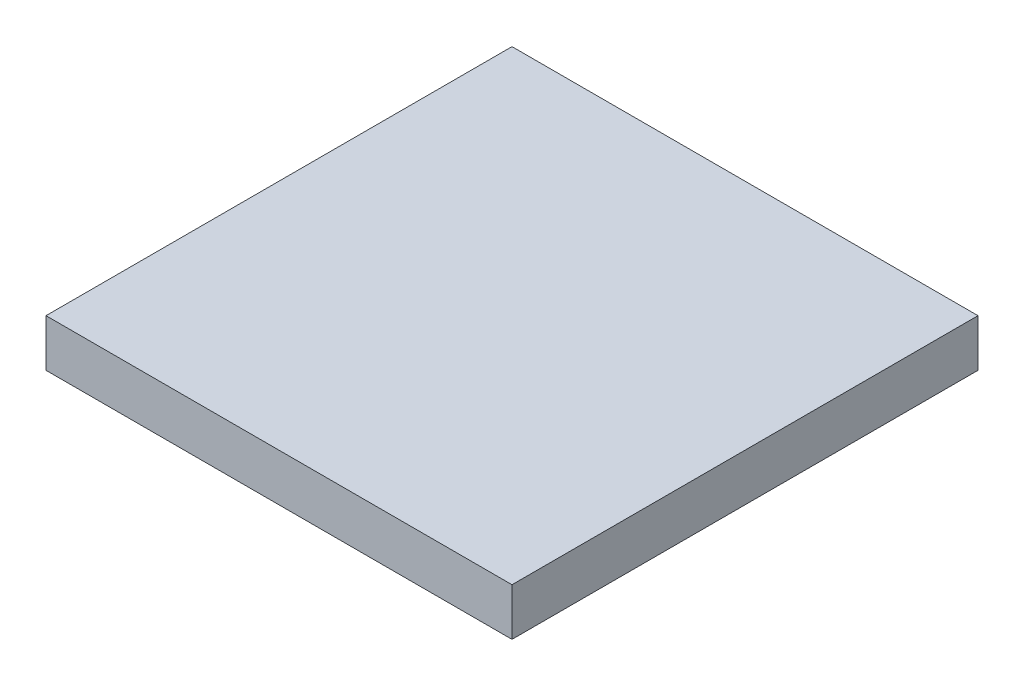
ISO-10303-21;
HEADER;
FILE_DESCRIPTION(('STEP AP214'),'2;1');
FILE_NAME('part.step','',(''),(''),'','','');
FILE_SCHEMA(('AUTOMOTIVE_DESIGN { 1 0 10303 214 1 1 1 1 }'));
ENDSEC;
DATA;
#1=APPLICATION_CONTEXT('core data for automotive mechanical design processes');
#2=APPLICATION_PROTOCOL_DEFINITION('international standard','automotive_design',2000,#1);
#3=PRODUCT_CONTEXT('',#1,'mechanical');
#4=PRODUCT('Part','Part','',(#3));
#5=PRODUCT_RELATED_PRODUCT_CATEGORY('part','',(#4));
#6=PRODUCT_DEFINITION_FORMATION('','',#4);
#7=PRODUCT_DEFINITION_CONTEXT('part definition',#1,'design');
#8=PRODUCT_DEFINITION('design','',#6,#7);
#9=PRODUCT_DEFINITION_SHAPE('','',#8);
#10=(LENGTH_UNIT() NAMED_UNIT(*) SI_UNIT(.MILLI.,.METRE.));
#11=(NAMED_UNIT(*) PLANE_ANGLE_UNIT() SI_UNIT($,.RADIAN.));
#12=(NAMED_UNIT(*) SI_UNIT($,.STERADIAN.) SOLID_ANGLE_UNIT());
#13=UNCERTAINTY_MEASURE_WITH_UNIT(LENGTH_MEASURE(1.E-05),#10,'distance_accuracy_value','');
#14=(GEOMETRIC_REPRESENTATION_CONTEXT(3) GLOBAL_UNCERTAINTY_ASSIGNED_CONTEXT((#13)) GLOBAL_UNIT_ASSIGNED_CONTEXT((#10,
#11,#12)) REPRESENTATION_CONTEXT('',''));
#15=CARTESIAN_POINT('',(0.,0.,0.));
#16=DIRECTION('',(0.,0.,1.));
#17=DIRECTION('',(1.,0.,0.));
#18=AXIS2_PLACEMENT_3D('',#15,#16,#17);
#19=CARTESIAN_POINT('',(-125.,25.4,-125.));
#20=DIRECTION('',(1.,0.,0.));
#21=DIRECTION('',(0.,0.,-1.));
#22=AXIS2_PLACEMENT_3D('',#19,#20,#21);
#23=PLANE('',#22);
#24=DIRECTION('',(0.,0.,1.));
#25=VECTOR('',#24,1.);
#26=CARTESIAN_POINT('',(-125.,0.,-125.));
#27=LINE('',#26,#25);
#28=CARTESIAN_POINT('',(-125.,0.,-125.));
#29=VERTEX_POINT('',#28);
#30=CARTESIAN_POINT('',(-125.,0.,125.));
#31=VERTEX_POINT('',#30);
#32=EDGE_CURVE('E101',#29,#31,#27,.T.);
#33=ORIENTED_EDGE('',*,*,#32,.T.);
#34=DIRECTION('',(0.,-1.,0.));
#35=VECTOR('',#34,1.);
#36=CARTESIAN_POINT('',(-125.,25.4,125.));
#37=LINE('',#36,#35);
#38=CARTESIAN_POINT('',(-125.,25.4,125.));
#39=VERTEX_POINT('',#38);
#40=EDGE_CURVE('E11',#39,#31,#37,.T.);
#41=ORIENTED_EDGE('',*,*,#40,.F.);
#42=DIRECTION('',(0.,0.,1.));
#43=VECTOR('',#42,1.);
#44=CARTESIAN_POINT('',(-125.,25.4,-125.));
#45=LINE('',#44,#43);
#46=CARTESIAN_POINT('',(-125.,25.4,-125.));
#47=VERTEX_POINT('',#46);
#48=EDGE_CURVE('E89',#47,#39,#45,.T.);
#49=ORIENTED_EDGE('',*,*,#48,.F.);
#50=DIRECTION('',(0.,-1.,0.));
#51=VECTOR('',#50,1.);
#52=CARTESIAN_POINT('',(-125.,25.4,-125.));
#53=LINE('',#52,#51);
#54=EDGE_CURVE('E97',#47,#29,#53,.T.);
#55=ORIENTED_EDGE('',*,*,#54,.T.);
#56=EDGE_LOOP('',(#33,#41,#49,#55));
#57=FACE_BOUND('',#56,.T.);
#58=ADVANCED_FACE('F38',(#57),#23,.F.);
#59=CARTESIAN_POINT('',(-125.,25.4,125.));
#60=DIRECTION('',(0.,0.,-1.));
#61=DIRECTION('',(-1.,0.,0.));
#62=AXIS2_PLACEMENT_3D('',#59,#60,#61);
#63=PLANE('',#62);
#64=DIRECTION('',(1.,0.,0.));
#65=VECTOR('',#64,1.);
#66=CARTESIAN_POINT('',(-125.,0.,125.));
#67=LINE('',#66,#65);
#68=CARTESIAN_POINT('',(125.,0.,125.));
#69=VERTEX_POINT('',#68);
#70=EDGE_CURVE('E93',#31,#69,#67,.T.);
#71=ORIENTED_EDGE('',*,*,#70,.T.);
#72=DIRECTION('',(0.,-1.,0.));
#73=VECTOR('',#72,1.);
#74=CARTESIAN_POINT('',(125.,25.4,125.));
#75=LINE('',#74,#73);
#76=CARTESIAN_POINT('',(125.,25.4,125.));
#77=VERTEX_POINT('',#76);
#78=EDGE_CURVE('E46',#77,#69,#75,.T.);
#79=ORIENTED_EDGE('',*,*,#78,.F.);
#80=DIRECTION('',(1.,0.,0.));
#81=VECTOR('',#80,1.);
#82=CARTESIAN_POINT('',(-125.,25.4,125.));
#83=LINE('',#82,#81);
#84=EDGE_CURVE('E84',#39,#77,#83,.T.);
#85=ORIENTED_EDGE('',*,*,#84,.F.);
#86=ORIENTED_EDGE('',*,*,#40,.T.);
#87=EDGE_LOOP('',(#71,#79,#85,#86));
#88=FACE_BOUND('',#87,.T.);
#89=ADVANCED_FACE('F92',(#88),#63,.F.);
#90=CARTESIAN_POINT('',(125.,25.4,-125.));
#91=DIRECTION('',(-1.,0.,0.));
#92=DIRECTION('',(0.,0.,1.));
#93=AXIS2_PLACEMENT_3D('',#90,#91,#92);
#94=PLANE('',#93);
#95=DIRECTION('',(0.,0.,-1.));
#96=VECTOR('',#95,1.);
#97=CARTESIAN_POINT('',(125.,0.,-125.));
#98=LINE('',#97,#96);
#99=CARTESIAN_POINT('',(125.,0.,-125.));
#100=VERTEX_POINT('',#99);
#101=EDGE_CURVE('E71',#69,#100,#98,.T.);
#102=ORIENTED_EDGE('',*,*,#101,.T.);
#103=DIRECTION('',(0.,-1.,0.));
#104=VECTOR('',#103,1.);
#105=CARTESIAN_POINT('',(125.,25.4,-125.));
#106=LINE('',#105,#104);
#107=CARTESIAN_POINT('',(125.,25.4,-125.));
#108=VERTEX_POINT('',#107);
#109=EDGE_CURVE('E94',#108,#100,#106,.T.);
#110=ORIENTED_EDGE('',*,*,#109,.F.);
#111=DIRECTION('',(0.,0.,-1.));
#112=VECTOR('',#111,1.);
#113=CARTESIAN_POINT('',(125.,25.4,-125.));
#114=LINE('',#113,#112);
#115=EDGE_CURVE('E87',#77,#108,#114,.T.);
#116=ORIENTED_EDGE('',*,*,#115,.F.);
#117=ORIENTED_EDGE('',*,*,#78,.T.);
#118=EDGE_LOOP('',(#102,#110,#116,#117));
#119=FACE_BOUND('',#118,.T.);
#120=ADVANCED_FACE('F95',(#119),#94,.F.);
#121=CARTESIAN_POINT('',(-125.,25.4,-125.));
#122=DIRECTION('',(0.,0.,1.));
#123=DIRECTION('',(1.,0.,0.));
#124=AXIS2_PLACEMENT_3D('',#121,#122,#123);
#125=PLANE('',#124);
#126=DIRECTION('',(-1.,0.,0.));
#127=VECTOR('',#126,1.);
#128=CARTESIAN_POINT('',(-125.,0.,-125.));
#129=LINE('',#128,#127);
#130=EDGE_CURVE('E77',#100,#29,#129,.T.);
#131=ORIENTED_EDGE('',*,*,#130,.T.);
#132=ORIENTED_EDGE('',*,*,#54,.F.);
#133=DIRECTION('',(-1.,0.,0.));
#134=VECTOR('',#133,1.);
#135=CARTESIAN_POINT('',(-125.,25.4,-125.));
#136=LINE('',#135,#134);
#137=EDGE_CURVE('E54',#108,#47,#136,.T.);
#138=ORIENTED_EDGE('',*,*,#137,.F.);
#139=ORIENTED_EDGE('',*,*,#109,.T.);
#140=EDGE_LOOP('',(#131,#132,#138,#139));
#141=FACE_BOUND('',#140,.T.);
#142=ADVANCED_FACE('F108',(#141),#125,.F.);
#143=CARTESIAN_POINT('',(0.,25.4,0.));
#144=DIRECTION('',(0.,1.,0.));
#145=DIRECTION('',(0.,0.,1.));
#146=AXIS2_PLACEMENT_3D('',#143,#144,#145);
#147=PLANE('',#146);
#148=ORIENTED_EDGE('',*,*,#48,.T.);
#149=ORIENTED_EDGE('',*,*,#84,.T.);
#150=ORIENTED_EDGE('',*,*,#115,.T.);
#151=ORIENTED_EDGE('',*,*,#137,.T.);
#152=EDGE_LOOP('',(#148,#149,#150,#151));
#153=FACE_BOUND('',#152,.T.);
#154=ADVANCED_FACE('F85',(#153),#147,.T.);
#155=CARTESIAN_POINT('',(0.,0.,0.));
#156=DIRECTION('',(0.,1.,0.));
#157=DIRECTION('',(0.,0.,1.));
#158=AXIS2_PLACEMENT_3D('',#155,#156,#157);
#159=PLANE('',#158);
#160=ORIENTED_EDGE('',*,*,#32,.F.);
#161=ORIENTED_EDGE('',*,*,#130,.F.);
#162=ORIENTED_EDGE('',*,*,#101,.F.);
#163=ORIENTED_EDGE('',*,*,#70,.F.);
#164=EDGE_LOOP('',(#160,#161,#162,#163));
#165=FACE_BOUND('',#164,.T.);
#166=ADVANCED_FACE('F111',(#165),#159,.F.);
#167=CLOSED_SHELL('',(#58,#89,#120,#142,#154,#166));
#168=MANIFOLD_SOLID_BREP('B2',#167);
#169=ADVANCED_BREP_SHAPE_REPRESENTATION('',(#18,#168),#14);
#170=SHAPE_DEFINITION_REPRESENTATION(#9,#169);
ENDSEC;
END-ISO-10303-21;
